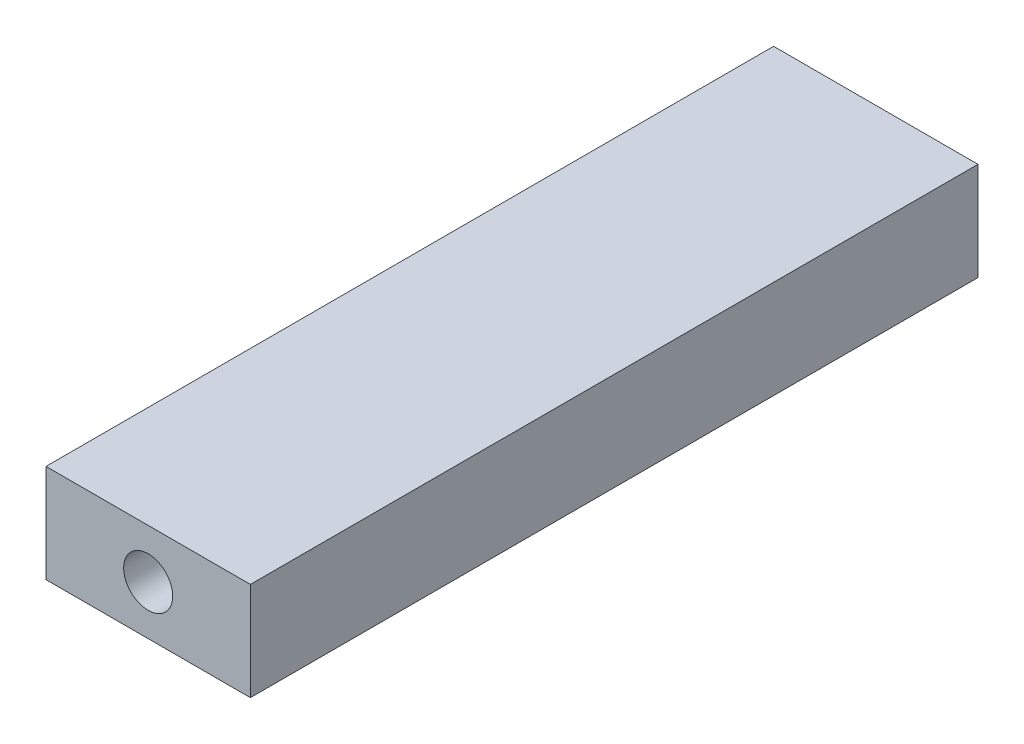
ISO-10303-21;
HEADER;
FILE_DESCRIPTION(('STEP AP214'),'2;1');
FILE_NAME('part.step','',(''),(''),'','','');
FILE_SCHEMA(('AUTOMOTIVE_DESIGN { 1 0 10303 214 1 1 1 1 }'));
ENDSEC;
DATA;
#1=APPLICATION_CONTEXT('core data for automotive mechanical design processes');
#2=APPLICATION_PROTOCOL_DEFINITION('international standard','automotive_design',2000,#1);
#3=PRODUCT_CONTEXT('',#1,'mechanical');
#4=PRODUCT('Part','Part','',(#3));
#5=PRODUCT_RELATED_PRODUCT_CATEGORY('part','',(#4));
#6=PRODUCT_DEFINITION_FORMATION('','',#4);
#7=PRODUCT_DEFINITION_CONTEXT('part definition',#1,'design');
#8=PRODUCT_DEFINITION('design','',#6,#7);
#9=PRODUCT_DEFINITION_SHAPE('','',#8);
#10=(LENGTH_UNIT() NAMED_UNIT(*) SI_UNIT(.MILLI.,.METRE.));
#11=(NAMED_UNIT(*) PLANE_ANGLE_UNIT() SI_UNIT($,.RADIAN.));
#12=(NAMED_UNIT(*) SI_UNIT($,.STERADIAN.) SOLID_ANGLE_UNIT());
#13=UNCERTAINTY_MEASURE_WITH_UNIT(LENGTH_MEASURE(1.E-05),#10,'distance_accuracy_value','');
#14=(GEOMETRIC_REPRESENTATION_CONTEXT(3) GLOBAL_UNCERTAINTY_ASSIGNED_CONTEXT((#13)) GLOBAL_UNIT_ASSIGNED_CONTEXT((#10,
#11,#12)) REPRESENTATION_CONTEXT('',''));
#15=CARTESIAN_POINT('',(0.,0.,0.));
#16=DIRECTION('',(0.,0.,1.));
#17=DIRECTION('',(1.,0.,0.));
#18=AXIS2_PLACEMENT_3D('',#15,#16,#17);
#19=CARTESIAN_POINT('',(0.,0.,35.6));
#20=DIRECTION('',(1.,0.,0.));
#21=DIRECTION('',(0.,1.,0.));
#22=AXIS2_PLACEMENT_3D('',#19,#20,#21);
#23=PLANE('',#22);
#24=DIRECTION('',(0.,-1.,0.));
#25=VECTOR('',#24,1.);
#26=CARTESIAN_POINT('',(0.,0.,0.));
#27=LINE('',#26,#25);
#28=CARTESIAN_POINT('',(0.,0.,0.));
#29=VERTEX_POINT('',#28);
#30=CARTESIAN_POINT('',(0.,-4.8,0.));
#31=VERTEX_POINT('',#30);
#32=EDGE_CURVE('E99',#29,#31,#27,.T.);
#33=ORIENTED_EDGE('',*,*,#32,.T.);
#34=DIRECTION('',(0.,0.,-1.));
#35=VECTOR('',#34,1.);
#36=CARTESIAN_POINT('',(0.,-4.8,35.6));
#37=LINE('',#36,#35);
#38=CARTESIAN_POINT('',(0.,-4.8,35.6));
#39=VERTEX_POINT('',#38);
#40=EDGE_CURVE('E11',#39,#31,#37,.T.);
#41=ORIENTED_EDGE('',*,*,#40,.F.);
#42=DIRECTION('',(0.,-1.,0.));
#43=VECTOR('',#42,1.);
#44=CARTESIAN_POINT('',(0.,0.,35.6));
#45=LINE('',#44,#43);
#46=CARTESIAN_POINT('',(0.,0.,35.6));
#47=VERTEX_POINT('',#46);
#48=EDGE_CURVE('E87',#47,#39,#45,.T.);
#49=ORIENTED_EDGE('',*,*,#48,.F.);
#50=DIRECTION('',(0.,0.,-1.));
#51=VECTOR('',#50,1.);
#52=CARTESIAN_POINT('',(0.,0.,35.6));
#53=LINE('',#52,#51);
#54=EDGE_CURVE('E95',#47,#29,#53,.T.);
#55=ORIENTED_EDGE('',*,*,#54,.T.);
#56=EDGE_LOOP('',(#33,#41,#49,#55));
#57=FACE_BOUND('',#56,.T.);
#58=ADVANCED_FACE('F36',(#57),#23,.F.);
#59=CARTESIAN_POINT('',(0.,-4.8,35.6));
#60=DIRECTION('',(0.,1.,0.));
#61=DIRECTION('',(0.,0.,1.));
#62=AXIS2_PLACEMENT_3D('',#59,#60,#61);
#63=PLANE('',#62);
#64=DIRECTION('',(1.,0.,0.));
#65=VECTOR('',#64,1.);
#66=CARTESIAN_POINT('',(0.,-4.8,0.));
#67=LINE('',#66,#65);
#68=CARTESIAN_POINT('',(10.,-4.8,0.));
#69=VERTEX_POINT('',#68);
#70=EDGE_CURVE('E91',#31,#69,#67,.T.);
#71=ORIENTED_EDGE('',*,*,#70,.T.);
#72=DIRECTION('',(0.,0.,-1.));
#73=VECTOR('',#72,1.);
#74=CARTESIAN_POINT('',(10.,-4.8,35.6));
#75=LINE('',#74,#73);
#76=CARTESIAN_POINT('',(10.,-4.8,35.6));
#77=VERTEX_POINT('',#76);
#78=EDGE_CURVE('E44',#77,#69,#75,.T.);
#79=ORIENTED_EDGE('',*,*,#78,.F.);
#80=DIRECTION('',(1.,0.,0.));
#81=VECTOR('',#80,1.);
#82=CARTESIAN_POINT('',(0.,-4.8,35.6));
#83=LINE('',#82,#81);
#84=EDGE_CURVE('E82',#39,#77,#83,.T.);
#85=ORIENTED_EDGE('',*,*,#84,.F.);
#86=ORIENTED_EDGE('',*,*,#40,.T.);
#87=EDGE_LOOP('',(#71,#79,#85,#86));
#88=FACE_BOUND('',#87,.T.);
#89=ADVANCED_FACE('F90',(#88),#63,.F.);
#90=CARTESIAN_POINT('',(10.,0.,35.6));
#91=DIRECTION('',(-1.,0.,0.));
#92=DIRECTION('',(0.,0.,1.));
#93=AXIS2_PLACEMENT_3D('',#90,#91,#92);
#94=PLANE('',#93);
#95=DIRECTION('',(0.,1.,0.));
#96=VECTOR('',#95,1.);
#97=CARTESIAN_POINT('',(10.,0.,0.));
#98=LINE('',#97,#96);
#99=CARTESIAN_POINT('',(10.,0.,0.));
#100=VERTEX_POINT('',#99);
#101=EDGE_CURVE('E69',#69,#100,#98,.T.);
#102=ORIENTED_EDGE('',*,*,#101,.T.);
#103=DIRECTION('',(0.,0.,-1.));
#104=VECTOR('',#103,1.);
#105=CARTESIAN_POINT('',(10.,0.,35.6));
#106=LINE('',#105,#104);
#107=CARTESIAN_POINT('',(10.,0.,35.6));
#108=VERTEX_POINT('',#107);
#109=EDGE_CURVE('E92',#108,#100,#106,.T.);
#110=ORIENTED_EDGE('',*,*,#109,.F.);
#111=DIRECTION('',(0.,1.,0.));
#112=VECTOR('',#111,1.);
#113=CARTESIAN_POINT('',(10.,0.,35.6));
#114=LINE('',#113,#112);
#115=EDGE_CURVE('E85',#77,#108,#114,.T.);
#116=ORIENTED_EDGE('',*,*,#115,.F.);
#117=ORIENTED_EDGE('',*,*,#78,.T.);
#118=EDGE_LOOP('',(#102,#110,#116,#117));
#119=FACE_BOUND('',#118,.T.);
#120=ADVANCED_FACE('F93',(#119),#94,.F.);
#121=CARTESIAN_POINT('',(0.,0.,35.6));
#122=DIRECTION('',(0.,-1.,0.));
#123=DIRECTION('',(0.,0.,-1.));
#124=AXIS2_PLACEMENT_3D('',#121,#122,#123);
#125=PLANE('',#124);
#126=DIRECTION('',(-1.,0.,0.));
#127=VECTOR('',#126,1.);
#128=CARTESIAN_POINT('',(0.,0.,0.));
#129=LINE('',#128,#127);
#130=EDGE_CURVE('E75',#100,#29,#129,.T.);
#131=ORIENTED_EDGE('',*,*,#130,.T.);
#132=ORIENTED_EDGE('',*,*,#54,.F.);
#133=DIRECTION('',(-1.,0.,0.));
#134=VECTOR('',#133,1.);
#135=CARTESIAN_POINT('',(0.,0.,35.6));
#136=LINE('',#135,#134);
#137=EDGE_CURVE('E52',#108,#47,#136,.T.);
#138=ORIENTED_EDGE('',*,*,#137,.F.);
#139=ORIENTED_EDGE('',*,*,#109,.T.);
#140=EDGE_LOOP('',(#131,#132,#138,#139));
#141=FACE_BOUND('',#140,.T.);
#142=ADVANCED_FACE('F107',(#141),#125,.F.);
#143=CARTESIAN_POINT('',(0.,0.,35.6));
#144=DIRECTION('',(0.,0.,1.));
#145=DIRECTION('',(1.,0.,0.));
#146=AXIS2_PLACEMENT_3D('',#143,#144,#145);
#147=PLANE('',#146);
#148=CARTESIAN_POINT('',(5.,-2.4,35.6));
#149=DIRECTION('',(0.,0.,1.));
#150=DIRECTION('',(1.,0.,0.));
#151=AXIS2_PLACEMENT_3D('',#148,#149,#150);
#152=CIRCLE('',#151,1.2);
#153=CARTESIAN_POINT('',(6.2,-2.4,35.6));
#154=VERTEX_POINT('',#153);
#155=EDGE_CURVE('E113',#154,#154,#152,.T.);
#156=ORIENTED_EDGE('',*,*,#155,.F.);
#157=EDGE_LOOP('',(#156));
#158=FACE_BOUND('',#157,.T.);
#159=ORIENTED_EDGE('',*,*,#48,.T.);
#160=ORIENTED_EDGE('',*,*,#84,.T.);
#161=ORIENTED_EDGE('',*,*,#115,.T.);
#162=ORIENTED_EDGE('',*,*,#137,.T.);
#163=EDGE_LOOP('',(#159,#160,#161,#162));
#164=FACE_BOUND('',#163,.T.);
#165=ADVANCED_FACE('F83',(#158,#164),#147,.T.);
#166=CARTESIAN_POINT('',(0.,0.,0.));
#167=DIRECTION('',(0.,0.,1.));
#168=DIRECTION('',(1.,0.,0.));
#169=AXIS2_PLACEMENT_3D('',#166,#167,#168);
#170=PLANE('',#169);
#171=CARTESIAN_POINT('',(5.,-2.4,0.));
#172=DIRECTION('',(0.,0.,1.));
#173=DIRECTION('',(1.,0.,0.));
#174=AXIS2_PLACEMENT_3D('',#171,#172,#173);
#175=CIRCLE('',#174,1.2);
#176=CARTESIAN_POINT('',(6.2,-2.4,0.));
#177=VERTEX_POINT('',#176);
#178=EDGE_CURVE('E102',#177,#177,#175,.T.);
#179=ORIENTED_EDGE('',*,*,#178,.T.);
#180=EDGE_LOOP('',(#179));
#181=FACE_BOUND('',#180,.T.);
#182=ORIENTED_EDGE('',*,*,#32,.F.);
#183=ORIENTED_EDGE('',*,*,#130,.F.);
#184=ORIENTED_EDGE('',*,*,#101,.F.);
#185=ORIENTED_EDGE('',*,*,#70,.F.);
#186=EDGE_LOOP('',(#182,#183,#184,#185));
#187=FACE_BOUND('',#186,.T.);
#188=ADVANCED_FACE('F110',(#181,#187),#170,.F.);
#189=CARTESIAN_POINT('',(5.,-2.4,0.));
#190=DIRECTION('',(0.,0.,1.));
#191=DIRECTION('',(1.,0.,0.));
#192=AXIS2_PLACEMENT_3D('',#189,#190,#191);
#193=CYLINDRICAL_SURFACE('',#192,1.2);
#194=ORIENTED_EDGE('',*,*,#178,.F.);
#195=EDGE_LOOP('',(#194));
#196=FACE_BOUND('',#195,.T.);
#197=ORIENTED_EDGE('',*,*,#155,.T.);
#198=EDGE_LOOP('',(#197));
#199=FACE_BOUND('',#198,.T.);
#200=ADVANCED_FACE('F120',(#196,#199),#193,.F.);
#201=CLOSED_SHELL('',(#58,#89,#120,#142,#165,#188,#200));
#202=MANIFOLD_SOLID_BREP('B2',#201);
#203=ADVANCED_BREP_SHAPE_REPRESENTATION('',(#18,#202),#14);
#204=SHAPE_DEFINITION_REPRESENTATION(#9,#203);
ENDSEC;
END-ISO-10303-21;
